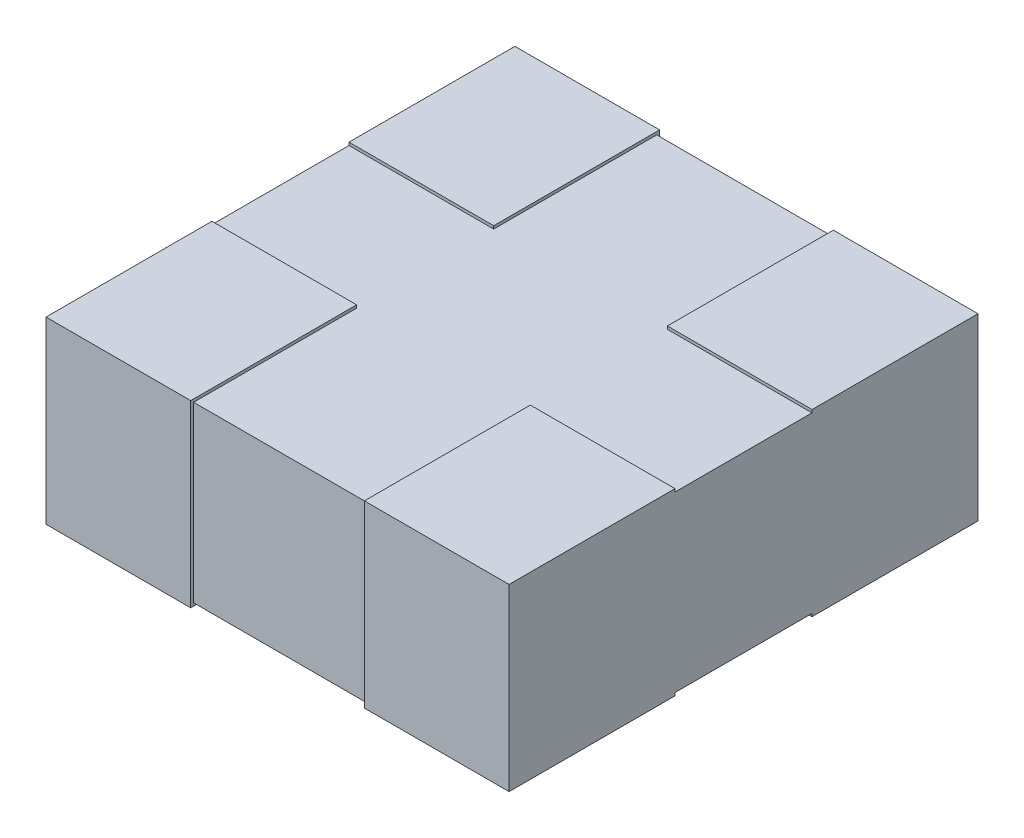
ISO-10303-21;
HEADER;
FILE_DESCRIPTION(('STEP AP214'),'2;1');
FILE_NAME('part.step','',(''),(''),'','','');
FILE_SCHEMA(('AUTOMOTIVE_DESIGN { 1 0 10303 214 1 1 1 1 }'));
ENDSEC;
DATA;
#1=APPLICATION_CONTEXT('core data for automotive mechanical design processes');
#2=APPLICATION_PROTOCOL_DEFINITION('international standard','automotive_design',2000,#1);
#3=PRODUCT_CONTEXT('',#1,'mechanical');
#4=PRODUCT('Part','Part','',(#3));
#5=PRODUCT_RELATED_PRODUCT_CATEGORY('part','',(#4));
#6=PRODUCT_DEFINITION_FORMATION('','',#4);
#7=PRODUCT_DEFINITION_CONTEXT('part definition',#1,'design');
#8=PRODUCT_DEFINITION('design','',#6,#7);
#9=PRODUCT_DEFINITION_SHAPE('','',#8);
#10=(LENGTH_UNIT() NAMED_UNIT(*) SI_UNIT(.MILLI.,.METRE.));
#11=(NAMED_UNIT(*) PLANE_ANGLE_UNIT() SI_UNIT($,.RADIAN.));
#12=(NAMED_UNIT(*) SI_UNIT($,.STERADIAN.) SOLID_ANGLE_UNIT());
#13=UNCERTAINTY_MEASURE_WITH_UNIT(LENGTH_MEASURE(1.E-05),#10,'distance_accuracy_value','');
#14=(GEOMETRIC_REPRESENTATION_CONTEXT(3) GLOBAL_UNCERTAINTY_ASSIGNED_CONTEXT((#13)) GLOBAL_UNIT_ASSIGNED_CONTEXT((#10,
#11,#12)) REPRESENTATION_CONTEXT('',''));
#15=CARTESIAN_POINT('',(0.,0.,0.));
#16=DIRECTION('',(0.,0.,1.));
#17=DIRECTION('',(1.,0.,0.));
#18=AXIS2_PLACEMENT_3D('',#15,#16,#17);
#19=CARTESIAN_POINT('',(0.,0.6,0.));
#20=DIRECTION('',(0.,1.,0.));
#21=DIRECTION('',(0.,0.,1.));
#22=AXIS2_PLACEMENT_3D('',#19,#20,#21);
#23=PLANE('',#22);
#24=DIRECTION('',(0.,0.,-1.));
#25=VECTOR('',#24,1.);
#26=CARTESIAN_POINT('',(0.8,0.6,-0.8));
#27=LINE('',#26,#25);
#28=CARTESIAN_POINT('',(0.8,0.6,0.236736987308278));
#29=VERTEX_POINT('',#28);
#30=CARTESIAN_POINT('',(0.8,0.6,-0.236736987308278));
#31=VERTEX_POINT('',#30);
#32=EDGE_CURVE('E406',#29,#31,#27,.T.);
#33=ORIENTED_EDGE('',*,*,#32,.T.);
#34=DIRECTION('',(-1.,0.,0.));
#35=VECTOR('',#34,1.);
#36=CARTESIAN_POINT('',(0.,0.6,-0.236736987308278));
#37=LINE('',#36,#35);
#38=CARTESIAN_POINT('',(0.3,0.6,-0.236736987308278));
#39=VERTEX_POINT('',#38);
#40=EDGE_CURVE('E50',#31,#39,#37,.T.);
#41=ORIENTED_EDGE('',*,*,#40,.T.);
#42=DIRECTION('',(0.,0.,-1.));
#43=VECTOR('',#42,1.);
#44=CARTESIAN_POINT('',(0.3,0.6,0.));
#45=LINE('',#44,#43);
#46=CARTESIAN_POINT('',(0.3,0.6,-0.8));
#47=VERTEX_POINT('',#46);
#48=EDGE_CURVE('E271',#39,#47,#45,.T.);
#49=ORIENTED_EDGE('',*,*,#48,.T.);
#50=DIRECTION('',(-1.,0.,0.));
#51=VECTOR('',#50,1.);
#52=CARTESIAN_POINT('',(-0.8,0.6,-0.8));
#53=LINE('',#52,#51);
#54=CARTESIAN_POINT('',(-0.3,0.6,-0.8));
#55=VERTEX_POINT('',#54);
#56=EDGE_CURVE('E408',#47,#55,#53,.T.);
#57=ORIENTED_EDGE('',*,*,#56,.T.);
#58=DIRECTION('',(0.,0.,1.));
#59=VECTOR('',#58,1.);
#60=CARTESIAN_POINT('',(-0.3,0.6,0.));
#61=LINE('',#60,#59);
#62=CARTESIAN_POINT('',(-0.3,0.6,-0.236736987308278));
#63=VERTEX_POINT('',#62);
#64=EDGE_CURVE('E351',#55,#63,#61,.T.);
#65=ORIENTED_EDGE('',*,*,#64,.T.);
#66=DIRECTION('',(1.,0.,0.));
#67=VECTOR('',#66,1.);
#68=CARTESIAN_POINT('',(0.,0.6,-0.236736987308278));
#69=LINE('',#68,#67);
#70=CARTESIAN_POINT('',(-0.8,0.6,-0.236736987308278));
#71=VERTEX_POINT('',#70);
#72=EDGE_CURVE('E354',#71,#63,#69,.T.);
#73=ORIENTED_EDGE('',*,*,#72,.F.);
#74=DIRECTION('',(0.,0.,1.));
#75=VECTOR('',#74,1.);
#76=CARTESIAN_POINT('',(-0.8,0.6,-0.8));
#77=LINE('',#76,#75);
#78=CARTESIAN_POINT('',(-0.8,0.6,0.236736987308278));
#79=VERTEX_POINT('',#78);
#80=EDGE_CURVE('E400',#71,#79,#77,.T.);
#81=ORIENTED_EDGE('',*,*,#80,.T.);
#82=DIRECTION('',(-1.,0.,0.));
#83=VECTOR('',#82,1.);
#84=CARTESIAN_POINT('',(0.,0.6,0.236736987308278));
#85=LINE('',#84,#83);
#86=CARTESIAN_POINT('',(-0.3,0.6,0.236736987308278));
#87=VERTEX_POINT('',#86);
#88=EDGE_CURVE('E396',#87,#79,#85,.T.);
#89=ORIENTED_EDGE('',*,*,#88,.F.);
#90=DIRECTION('',(0.,0.,-1.));
#91=VECTOR('',#90,1.);
#92=CARTESIAN_POINT('',(-0.3,0.6,0.));
#93=LINE('',#92,#91);
#94=CARTESIAN_POINT('',(-0.3,0.6,0.8));
#95=VERTEX_POINT('',#94);
#96=EDGE_CURVE('E394',#95,#87,#93,.T.);
#97=ORIENTED_EDGE('',*,*,#96,.F.);
#98=DIRECTION('',(1.,0.,0.));
#99=VECTOR('',#98,1.);
#100=CARTESIAN_POINT('',(-0.8,0.6,0.8));
#101=LINE('',#100,#99);
#102=CARTESIAN_POINT('',(0.3,0.6,0.8));
#103=VERTEX_POINT('',#102);
#104=EDGE_CURVE('E402',#95,#103,#101,.T.);
#105=ORIENTED_EDGE('',*,*,#104,.T.);
#106=DIRECTION('',(0.,0.,1.));
#107=VECTOR('',#106,1.);
#108=CARTESIAN_POINT('',(0.3,0.6,0.));
#109=LINE('',#108,#107);
#110=CARTESIAN_POINT('',(0.3,0.6,0.236736987308278));
#111=VERTEX_POINT('',#110);
#112=EDGE_CURVE('E309',#111,#103,#109,.T.);
#113=ORIENTED_EDGE('',*,*,#112,.F.);
#114=DIRECTION('',(1.,0.,0.));
#115=VECTOR('',#114,1.);
#116=CARTESIAN_POINT('',(0.,0.6,0.236736987308278));
#117=LINE('',#116,#115);
#118=EDGE_CURVE('E311',#111,#29,#117,.T.);
#119=ORIENTED_EDGE('',*,*,#118,.T.);
#120=EDGE_LOOP('',(#33,#41,#49,#57,#65,#73,#81,#89,#97,#105,#113,#119));
#121=FACE_BOUND('',#120,.T.);
#122=ADVANCED_FACE('F35',(#121),#23,.T.);
#123=CARTESIAN_POINT('',(0.,0.,0.));
#124=DIRECTION('',(0.,1.,0.));
#125=DIRECTION('',(0.,0.,1.));
#126=AXIS2_PLACEMENT_3D('',#123,#124,#125);
#127=PLANE('',#126);
#128=DIRECTION('',(-1.,0.,0.));
#129=VECTOR('',#128,1.);
#130=CARTESIAN_POINT('',(0.,0.,-0.236736987308278));
#131=LINE('',#130,#129);
#132=CARTESIAN_POINT('',(0.8,0.,-0.236736987308278));
#133=VERTEX_POINT('',#132);
#134=CARTESIAN_POINT('',(0.3,0.,-0.236736987308278));
#135=VERTEX_POINT('',#134);
#136=EDGE_CURVE('E263',#133,#135,#131,.T.);
#137=ORIENTED_EDGE('',*,*,#136,.F.);
#138=DIRECTION('',(0.,0.,-1.));
#139=VECTOR('',#138,1.);
#140=CARTESIAN_POINT('',(0.8,0.,-0.8));
#141=LINE('',#140,#139);
#142=CARTESIAN_POINT('',(0.8,0.,0.236736987308277));
#143=VERTEX_POINT('',#142);
#144=EDGE_CURVE('E415',#143,#133,#141,.T.);
#145=ORIENTED_EDGE('',*,*,#144,.F.);
#146=DIRECTION('',(1.,0.,0.));
#147=VECTOR('',#146,1.);
#148=CARTESIAN_POINT('',(0.,0.,0.236736987308278));
#149=LINE('',#148,#147);
#150=CARTESIAN_POINT('',(0.3,0.,0.236736987308278));
#151=VERTEX_POINT('',#150);
#152=EDGE_CURVE('E43',#151,#143,#149,.T.);
#153=ORIENTED_EDGE('',*,*,#152,.F.);
#154=DIRECTION('',(0.,0.,1.));
#155=VECTOR('',#154,1.);
#156=CARTESIAN_POINT('',(0.3,0.,0.));
#157=LINE('',#156,#155);
#158=CARTESIAN_POINT('',(0.3,0.,0.8));
#159=VERTEX_POINT('',#158);
#160=EDGE_CURVE('E429',#151,#159,#157,.T.);
#161=ORIENTED_EDGE('',*,*,#160,.T.);
#162=DIRECTION('',(1.,0.,0.));
#163=VECTOR('',#162,1.);
#164=CARTESIAN_POINT('',(-0.8,0.,0.8));
#165=LINE('',#164,#163);
#166=CARTESIAN_POINT('',(-0.3,0.,0.8));
#167=VERTEX_POINT('',#166);
#168=EDGE_CURVE('E412',#167,#159,#165,.T.);
#169=ORIENTED_EDGE('',*,*,#168,.F.);
#170=DIRECTION('',(0.,0.,-1.));
#171=VECTOR('',#170,1.);
#172=CARTESIAN_POINT('',(-0.3,0.,0.));
#173=LINE('',#172,#171);
#174=CARTESIAN_POINT('',(-0.3,0.,0.236736987308278));
#175=VERTEX_POINT('',#174);
#176=EDGE_CURVE('E410',#167,#175,#173,.T.);
#177=ORIENTED_EDGE('',*,*,#176,.T.);
#178=DIRECTION('',(-1.,0.,0.));
#179=VECTOR('',#178,1.);
#180=CARTESIAN_POINT('',(0.,0.,0.236736987308278));
#181=LINE('',#180,#179);
#182=CARTESIAN_POINT('',(-0.8,0.,0.236736987308278));
#183=VERTEX_POINT('',#182);
#184=EDGE_CURVE('E421',#175,#183,#181,.T.);
#185=ORIENTED_EDGE('',*,*,#184,.T.);
#186=DIRECTION('',(0.,0.,1.));
#187=VECTOR('',#186,1.);
#188=CARTESIAN_POINT('',(-0.8,0.,-0.8));
#189=LINE('',#188,#187);
#190=CARTESIAN_POINT('',(-0.8,0.,-0.236736987308278));
#191=VERTEX_POINT('',#190);
#192=EDGE_CURVE('E399',#191,#183,#189,.T.);
#193=ORIENTED_EDGE('',*,*,#192,.F.);
#194=DIRECTION('',(1.,0.,0.));
#195=VECTOR('',#194,1.);
#196=CARTESIAN_POINT('',(0.,0.,-0.236736987308278));
#197=LINE('',#196,#195);
#198=CARTESIAN_POINT('',(-0.3,0.,-0.236736987308278));
#199=VERTEX_POINT('',#198);
#200=EDGE_CURVE('E426',#191,#199,#197,.T.);
#201=ORIENTED_EDGE('',*,*,#200,.T.);
#202=DIRECTION('',(0.,0.,1.));
#203=VECTOR('',#202,1.);
#204=CARTESIAN_POINT('',(-0.3,0.,0.));
#205=LINE('',#204,#203);
#206=CARTESIAN_POINT('',(-0.3,0.,-0.8));
#207=VERTEX_POINT('',#206);
#208=EDGE_CURVE('E424',#207,#199,#205,.T.);
#209=ORIENTED_EDGE('',*,*,#208,.F.);
#210=DIRECTION('',(-1.,0.,0.));
#211=VECTOR('',#210,1.);
#212=CARTESIAN_POINT('',(-0.8,0.,-0.8));
#213=LINE('',#212,#211);
#214=CARTESIAN_POINT('',(0.3,0.,-0.8));
#215=VERTEX_POINT('',#214);
#216=EDGE_CURVE('E403',#215,#207,#213,.T.);
#217=ORIENTED_EDGE('',*,*,#216,.F.);
#218=DIRECTION('',(0.,0.,-1.));
#219=VECTOR('',#218,1.);
#220=CARTESIAN_POINT('',(0.3,0.,0.));
#221=LINE('',#220,#219);
#222=EDGE_CURVE('E58',#135,#215,#221,.T.);
#223=ORIENTED_EDGE('',*,*,#222,.F.);
#224=EDGE_LOOP('',(#137,#145,#153,#161,#169,#177,#185,#193,#201,#209,#217,#223));
#225=FACE_BOUND('',#224,.T.);
#226=ADVANCED_FACE('F438',(#225),#127,.F.);
#227=CARTESIAN_POINT('',(-0.8,0.6,-0.8));
#228=DIRECTION('',(0.,0.,1.));
#229=DIRECTION('',(1.,0.,0.));
#230=AXIS2_PLACEMENT_3D('',#227,#228,#229);
#231=PLANE('',#230);
#232=DIRECTION('',(0.,1.,0.));
#233=VECTOR('',#232,1.);
#234=CARTESIAN_POINT('',(0.3,0.6,-0.8));
#235=LINE('',#234,#233);
#236=EDGE_CURVE('E11',#215,#47,#235,.T.);
#237=ORIENTED_EDGE('',*,*,#236,.F.);
#238=ORIENTED_EDGE('',*,*,#216,.T.);
#239=DIRECTION('',(0.,-1.,0.));
#240=VECTOR('',#239,1.);
#241=CARTESIAN_POINT('',(-0.3,0.6,-0.8));
#242=LINE('',#241,#240);
#243=EDGE_CURVE('E342',#55,#207,#242,.T.);
#244=ORIENTED_EDGE('',*,*,#243,.F.);
#245=ORIENTED_EDGE('',*,*,#56,.F.);
#246=EDGE_LOOP('',(#237,#238,#244,#245));
#247=FACE_BOUND('',#246,.T.);
#248=ADVANCED_FACE('F469',(#247),#231,.F.);
#249=CARTESIAN_POINT('',(-0.8,0.6,-0.8));
#250=DIRECTION('',(1.,0.,0.));
#251=DIRECTION('',(0.,0.,-1.));
#252=AXIS2_PLACEMENT_3D('',#249,#250,#251);
#253=PLANE('',#252);
#254=ORIENTED_EDGE('',*,*,#80,.F.);
#255=DIRECTION('',(0.,1.,0.));
#256=VECTOR('',#255,1.);
#257=CARTESIAN_POINT('',(-0.8,-0.01,-0.236736987308278));
#258=LINE('',#257,#256);
#259=CARTESIAN_POINT('',(-0.8,0.61,-0.236736987308278));
#260=VERTEX_POINT('',#259);
#261=EDGE_CURVE('E335',#71,#260,#258,.T.);
#262=ORIENTED_EDGE('',*,*,#261,.T.);
#263=DIRECTION('',(0.,0.,-1.));
#264=VECTOR('',#263,1.);
#265=CARTESIAN_POINT('',(-0.8,0.61,-0.236736987308278));
#266=LINE('',#265,#264);
#267=CARTESIAN_POINT('',(-0.8,0.61,-0.81));
#268=VERTEX_POINT('',#267);
#269=EDGE_CURVE('E319',#260,#268,#266,.T.);
#270=ORIENTED_EDGE('',*,*,#269,.T.);
#271=DIRECTION('',(0.,-1.,0.));
#272=VECTOR('',#271,1.);
#273=CARTESIAN_POINT('',(-0.8,0.61,-0.81));
#274=LINE('',#273,#272);
#275=CARTESIAN_POINT('',(-0.8,-0.01,-0.81));
#276=VERTEX_POINT('',#275);
#277=EDGE_CURVE('E314',#268,#276,#274,.T.);
#278=ORIENTED_EDGE('',*,*,#277,.T.);
#279=DIRECTION('',(0.,0.,1.));
#280=VECTOR('',#279,1.);
#281=CARTESIAN_POINT('',(-0.8,-0.01,-0.81));
#282=LINE('',#281,#280);
#283=CARTESIAN_POINT('',(-0.8,-0.01,-0.236736987308278));
#284=VERTEX_POINT('',#283);
#285=EDGE_CURVE('E332',#276,#284,#282,.T.);
#286=ORIENTED_EDGE('',*,*,#285,.T.);
#287=EDGE_CURVE('E336',#284,#191,#258,.T.);
#288=ORIENTED_EDGE('',*,*,#287,.T.);
#289=ORIENTED_EDGE('',*,*,#192,.T.);
#290=DIRECTION('',(0.,-1.,0.));
#291=VECTOR('',#290,1.);
#292=CARTESIAN_POINT('',(-0.8,-0.01,0.236736987308278));
#293=LINE('',#292,#291);
#294=CARTESIAN_POINT('',(-0.8,-0.01,0.236736987308278));
#295=VERTEX_POINT('',#294);
#296=EDGE_CURVE('E380',#183,#295,#293,.T.);
#297=ORIENTED_EDGE('',*,*,#296,.T.);
#298=DIRECTION('',(0.,0.,1.));
#299=VECTOR('',#298,1.);
#300=CARTESIAN_POINT('',(-0.8,-0.01,0.81));
#301=LINE('',#300,#299);
#302=CARTESIAN_POINT('',(-0.8,-0.01,0.81));
#303=VERTEX_POINT('',#302);
#304=EDGE_CURVE('E356',#295,#303,#301,.T.);
#305=ORIENTED_EDGE('',*,*,#304,.T.);
#306=DIRECTION('',(0.,1.,0.));
#307=VECTOR('',#306,1.);
#308=CARTESIAN_POINT('',(-0.8,0.61,0.81));
#309=LINE('',#308,#307);
#310=CARTESIAN_POINT('',(-0.8,0.61,0.81));
#311=VERTEX_POINT('',#310);
#312=EDGE_CURVE('E374',#303,#311,#309,.T.);
#313=ORIENTED_EDGE('',*,*,#312,.T.);
#314=DIRECTION('',(0.,0.,-1.));
#315=VECTOR('',#314,1.);
#316=CARTESIAN_POINT('',(-0.8,0.61,0.236736987308278));
#317=LINE('',#316,#315);
#318=CARTESIAN_POINT('',(-0.8,0.61,0.236736987308278));
#319=VERTEX_POINT('',#318);
#320=EDGE_CURVE('E377',#311,#319,#317,.T.);
#321=ORIENTED_EDGE('',*,*,#320,.T.);
#322=EDGE_CURVE('E361',#319,#79,#293,.T.);
#323=ORIENTED_EDGE('',*,*,#322,.T.);
#324=EDGE_LOOP('',(#254,#262,#270,#278,#286,#288,#289,#297,#305,#313,#321,#323));
#325=FACE_BOUND('',#324,.T.);
#326=ADVANCED_FACE('F37',(#325),#253,.F.);
#327=CARTESIAN_POINT('',(-0.8,0.6,0.8));
#328=DIRECTION('',(0.,0.,-1.));
#329=DIRECTION('',(-1.,0.,0.));
#330=AXIS2_PLACEMENT_3D('',#327,#328,#329);
#331=PLANE('',#330);
#332=ORIENTED_EDGE('',*,*,#168,.T.);
#333=DIRECTION('',(0.,1.,0.));
#334=VECTOR('',#333,1.);
#335=CARTESIAN_POINT('',(0.3,0.6,0.8));
#336=LINE('',#335,#334);
#337=EDGE_CURVE('E298',#159,#103,#336,.T.);
#338=ORIENTED_EDGE('',*,*,#337,.T.);
#339=ORIENTED_EDGE('',*,*,#104,.F.);
#340=DIRECTION('',(0.,-1.,0.));
#341=VECTOR('',#340,1.);
#342=CARTESIAN_POINT('',(-0.3,0.6,0.8));
#343=LINE('',#342,#341);
#344=EDGE_CURVE('E386',#95,#167,#343,.T.);
#345=ORIENTED_EDGE('',*,*,#344,.T.);
#346=EDGE_LOOP('',(#332,#338,#339,#345));
#347=FACE_BOUND('',#346,.T.);
#348=ADVANCED_FACE('F480',(#347),#331,.F.);
#349=CARTESIAN_POINT('',(0.8,0.6,-0.8));
#350=DIRECTION('',(-1.,0.,0.));
#351=DIRECTION('',(0.,0.,1.));
#352=AXIS2_PLACEMENT_3D('',#349,#350,#351);
#353=PLANE('',#352);
#354=DIRECTION('',(0.,1.,0.));
#355=VECTOR('',#354,1.);
#356=CARTESIAN_POINT('',(0.8,-0.01,-0.236736987308278));
#357=LINE('',#356,#355);
#358=CARTESIAN_POINT('',(0.8,0.61,-0.236736987308278));
#359=VERTEX_POINT('',#358);
#360=EDGE_CURVE('E259',#31,#359,#357,.T.);
#361=ORIENTED_EDGE('',*,*,#360,.F.);
#362=ORIENTED_EDGE('',*,*,#32,.F.);
#363=DIRECTION('',(0.,-1.,0.));
#364=VECTOR('',#363,1.);
#365=CARTESIAN_POINT('',(0.8,-0.01,0.236736987308278));
#366=LINE('',#365,#364);
#367=CARTESIAN_POINT('',(0.8,0.61,0.236736987308278));
#368=VERTEX_POINT('',#367);
#369=EDGE_CURVE('E290',#368,#29,#366,.T.);
#370=ORIENTED_EDGE('',*,*,#369,.F.);
#371=DIRECTION('',(0.,0.,-1.));
#372=VECTOR('',#371,1.);
#373=CARTESIAN_POINT('',(0.8,0.61,0.236736987308278));
#374=LINE('',#373,#372);
#375=CARTESIAN_POINT('',(0.8,0.61,0.81));
#376=VERTEX_POINT('',#375);
#377=EDGE_CURVE('E292',#376,#368,#374,.T.);
#378=ORIENTED_EDGE('',*,*,#377,.F.);
#379=DIRECTION('',(0.,1.,0.));
#380=VECTOR('',#379,1.);
#381=CARTESIAN_POINT('',(0.8,0.61,0.81));
#382=LINE('',#381,#380);
#383=CARTESIAN_POINT('',(0.8,-0.01,0.81));
#384=VERTEX_POINT('',#383);
#385=EDGE_CURVE('E278',#384,#376,#382,.T.);
#386=ORIENTED_EDGE('',*,*,#385,.F.);
#387=DIRECTION('',(0.,0.,1.));
#388=VECTOR('',#387,1.);
#389=CARTESIAN_POINT('',(0.8,-0.01,0.81));
#390=LINE('',#389,#388);
#391=CARTESIAN_POINT('',(0.8,-0.01,0.236736987308278));
#392=VERTEX_POINT('',#391);
#393=EDGE_CURVE('E273',#392,#384,#390,.T.);
#394=ORIENTED_EDGE('',*,*,#393,.F.);
#395=EDGE_CURVE('E289',#143,#392,#366,.T.);
#396=ORIENTED_EDGE('',*,*,#395,.F.);
#397=ORIENTED_EDGE('',*,*,#144,.T.);
#398=CARTESIAN_POINT('',(0.8,-0.01,-0.236736987308278));
#399=VERTEX_POINT('',#398);
#400=EDGE_CURVE('E249',#399,#133,#357,.T.);
#401=ORIENTED_EDGE('',*,*,#400,.F.);
#402=DIRECTION('',(0.,0.,1.));
#403=VECTOR('',#402,1.);
#404=CARTESIAN_POINT('',(0.8,-0.01,-0.81));
#405=LINE('',#404,#403);
#406=CARTESIAN_POINT('',(0.8,-0.01,-0.81));
#407=VERTEX_POINT('',#406);
#408=EDGE_CURVE('E247',#407,#399,#405,.T.);
#409=ORIENTED_EDGE('',*,*,#408,.F.);
#410=DIRECTION('',(0.,-1.,0.));
#411=VECTOR('',#410,1.);
#412=CARTESIAN_POINT('',(0.8,0.61,-0.81));
#413=LINE('',#412,#411);
#414=CARTESIAN_POINT('',(0.8,0.61,-0.81));
#415=VERTEX_POINT('',#414);
#416=EDGE_CURVE('E256',#415,#407,#413,.T.);
#417=ORIENTED_EDGE('',*,*,#416,.F.);
#418=DIRECTION('',(0.,0.,-1.));
#419=VECTOR('',#418,1.);
#420=CARTESIAN_POINT('',(0.8,0.61,-0.236736987308278));
#421=LINE('',#420,#419);
#422=EDGE_CURVE('E237',#359,#415,#421,.T.);
#423=ORIENTED_EDGE('',*,*,#422,.F.);
#424=EDGE_LOOP('',(#361,#362,#370,#378,#386,#394,#396,#397,#401,#409,#417,#423));
#425=FACE_BOUND('',#424,.T.);
#426=ADVANCED_FACE('F442',(#425),#353,.F.);
#427=CARTESIAN_POINT('',(-0.3,-0.01,0.236736987308278));
#428=DIRECTION('',(0.,0.,-1.));
#429=DIRECTION('',(-1.,0.,0.));
#430=AXIS2_PLACEMENT_3D('',#427,#428,#429);
#431=PLANE('',#430);
#432=ORIENTED_EDGE('',*,*,#184,.F.);
#433=DIRECTION('',(0.,-1.,0.));
#434=VECTOR('',#433,1.);
#435=CARTESIAN_POINT('',(-0.3,-0.01,0.236736987308278));
#436=LINE('',#435,#434);
#437=CARTESIAN_POINT('',(-0.3,-0.01,0.236736987308278));
#438=VERTEX_POINT('',#437);
#439=EDGE_CURVE('E367',#175,#438,#436,.T.);
#440=ORIENTED_EDGE('',*,*,#439,.T.);
#441=DIRECTION('',(-1.,0.,0.));
#442=VECTOR('',#441,1.);
#443=CARTESIAN_POINT('',(-0.3,-0.01,0.236736987308278));
#444=LINE('',#443,#442);
#445=EDGE_CURVE('E383',#438,#295,#444,.T.);
#446=ORIENTED_EDGE('',*,*,#445,.T.);
#447=ORIENTED_EDGE('',*,*,#296,.F.);
#448=EDGE_LOOP('',(#432,#440,#446,#447));
#449=FACE_BOUND('',#448,.T.);
#450=ADVANCED_FACE('F479',(#449),#431,.T.);
#451=CARTESIAN_POINT('',(-0.3,-0.01,0.81));
#452=DIRECTION('',(0.,-1.,0.));
#453=DIRECTION('',(0.,0.,-1.));
#454=AXIS2_PLACEMENT_3D('',#451,#452,#453);
#455=PLANE('',#454);
#456=ORIENTED_EDGE('',*,*,#304,.F.);
#457=ORIENTED_EDGE('',*,*,#445,.F.);
#458=DIRECTION('',(0.,0.,1.));
#459=VECTOR('',#458,1.);
#460=CARTESIAN_POINT('',(-0.3,-0.01,0.81));
#461=LINE('',#460,#459);
#462=CARTESIAN_POINT('',(-0.3,-0.01,0.81));
#463=VERTEX_POINT('',#462);
#464=EDGE_CURVE('E357',#438,#463,#461,.T.);
#465=ORIENTED_EDGE('',*,*,#464,.T.);
#466=DIRECTION('',(-1.,0.,0.));
#467=VECTOR('',#466,1.);
#468=CARTESIAN_POINT('',(-0.3,-0.01,0.81));
#469=LINE('',#468,#467);
#470=EDGE_CURVE('E371',#463,#303,#469,.T.);
#471=ORIENTED_EDGE('',*,*,#470,.T.);
#472=EDGE_LOOP('',(#456,#457,#465,#471));
#473=FACE_BOUND('',#472,.T.);
#474=ADVANCED_FACE('F472',(#473),#455,.T.);
#475=CARTESIAN_POINT('',(-0.3,0.61,0.236736987308278));
#476=VERTEX_POINT('',#475);
#477=EDGE_CURVE('E368',#476,#87,#436,.T.);
#478=ORIENTED_EDGE('',*,*,#477,.T.);
#479=ORIENTED_EDGE('',*,*,#88,.T.);
#480=ORIENTED_EDGE('',*,*,#322,.F.);
#481=DIRECTION('',(-1.,0.,0.));
#482=VECTOR('',#481,1.);
#483=CARTESIAN_POINT('',(-0.3,0.61,0.236736987308278));
#484=LINE('',#483,#482);
#485=EDGE_CURVE('E387',#476,#319,#484,.T.);
#486=ORIENTED_EDGE('',*,*,#485,.F.);
#487=EDGE_LOOP('',(#478,#479,#480,#486));
#488=FACE_BOUND('',#487,.T.);
#489=ADVANCED_FACE('F499',(#488),#431,.T.);
#490=CARTESIAN_POINT('',(-0.3,0.61,0.236736987308278));
#491=DIRECTION('',(0.,1.,0.));
#492=DIRECTION('',(0.,0.,1.));
#493=AXIS2_PLACEMENT_3D('',#490,#491,#492);
#494=PLANE('',#493);
#495=ORIENTED_EDGE('',*,*,#320,.F.);
#496=DIRECTION('',(-1.,0.,0.));
#497=VECTOR('',#496,1.);
#498=CARTESIAN_POINT('',(-0.3,0.61,0.81));
#499=LINE('',#498,#497);
#500=CARTESIAN_POINT('',(-0.3,0.61,0.81));
#501=VERTEX_POINT('',#500);
#502=EDGE_CURVE('E389',#501,#311,#499,.T.);
#503=ORIENTED_EDGE('',*,*,#502,.F.);
#504=DIRECTION('',(0.,0.,-1.));
#505=VECTOR('',#504,1.);
#506=CARTESIAN_POINT('',(-0.3,0.61,0.236736987308278));
#507=LINE('',#506,#505);
#508=EDGE_CURVE('E364',#501,#476,#507,.T.);
#509=ORIENTED_EDGE('',*,*,#508,.T.);
#510=ORIENTED_EDGE('',*,*,#485,.T.);
#511=EDGE_LOOP('',(#495,#503,#509,#510));
#512=FACE_BOUND('',#511,.T.);
#513=ADVANCED_FACE('F503',(#512),#494,.T.);
#514=CARTESIAN_POINT('',(-0.3,0.61,0.81));
#515=DIRECTION('',(0.,0.,1.));
#516=DIRECTION('',(1.,0.,0.));
#517=AXIS2_PLACEMENT_3D('',#514,#515,#516);
#518=PLANE('',#517);
#519=ORIENTED_EDGE('',*,*,#312,.F.);
#520=ORIENTED_EDGE('',*,*,#470,.F.);
#521=DIRECTION('',(0.,1.,0.));
#522=VECTOR('',#521,1.);
#523=CARTESIAN_POINT('',(-0.3,0.61,0.81));
#524=LINE('',#523,#522);
#525=EDGE_CURVE('E360',#463,#501,#524,.T.);
#526=ORIENTED_EDGE('',*,*,#525,.T.);
#527=ORIENTED_EDGE('',*,*,#502,.T.);
#528=EDGE_LOOP('',(#519,#520,#526,#527));
#529=FACE_BOUND('',#528,.T.);
#530=ADVANCED_FACE('F508',(#529),#518,.T.);
#531=CARTESIAN_POINT('',(-0.3,0.,0.));
#532=DIRECTION('',(1.,0.,0.));
#533=DIRECTION('',(0.,0.,-1.));
#534=AXIS2_PLACEMENT_3D('',#531,#532,#533);
#535=PLANE('',#534);
#536=ORIENTED_EDGE('',*,*,#344,.F.);
#537=ORIENTED_EDGE('',*,*,#96,.T.);
#538=ORIENTED_EDGE('',*,*,#477,.F.);
#539=ORIENTED_EDGE('',*,*,#508,.F.);
#540=ORIENTED_EDGE('',*,*,#525,.F.);
#541=ORIENTED_EDGE('',*,*,#464,.F.);
#542=ORIENTED_EDGE('',*,*,#439,.F.);
#543=ORIENTED_EDGE('',*,*,#176,.F.);
#544=EDGE_LOOP('',(#536,#537,#538,#539,#540,#541,#542,#543));
#545=FACE_BOUND('',#544,.T.);
#546=ADVANCED_FACE('F496',(#545),#535,.T.);
#547=CARTESIAN_POINT('',(-0.3,-0.01,-0.236736987308278));
#548=DIRECTION('',(0.,0.,1.));
#549=DIRECTION('',(1.,0.,0.));
#550=AXIS2_PLACEMENT_3D('',#547,#548,#549);
#551=PLANE('',#550);
#552=ORIENTED_EDGE('',*,*,#200,.F.);
#553=ORIENTED_EDGE('',*,*,#287,.F.);
#554=DIRECTION('',(-1.,0.,0.));
#555=VECTOR('',#554,1.);
#556=CARTESIAN_POINT('',(-0.3,-0.01,-0.236736987308278));
#557=LINE('',#556,#555);
#558=CARTESIAN_POINT('',(-0.3,-0.01,-0.236736987308278));
#559=VERTEX_POINT('',#558);
#560=EDGE_CURVE('E346',#559,#284,#557,.T.);
#561=ORIENTED_EDGE('',*,*,#560,.F.);
#562=DIRECTION('',(0.,1.,0.));
#563=VECTOR('',#562,1.);
#564=CARTESIAN_POINT('',(-0.3,-0.01,-0.236736987308278));
#565=LINE('',#564,#563);
#566=EDGE_CURVE('E323',#559,#199,#565,.T.);
#567=ORIENTED_EDGE('',*,*,#566,.T.);
#568=EDGE_LOOP('',(#552,#553,#561,#567));
#569=FACE_BOUND('',#568,.T.);
#570=ADVANCED_FACE('F522',(#569),#551,.T.);
#571=CARTESIAN_POINT('',(-0.3,0.61,-0.81));
#572=DIRECTION('',(0.,0.,-1.));
#573=DIRECTION('',(-1.,0.,0.));
#574=AXIS2_PLACEMENT_3D('',#571,#572,#573);
#575=PLANE('',#574);
#576=ORIENTED_EDGE('',*,*,#277,.F.);
#577=DIRECTION('',(-1.,0.,0.));
#578=VECTOR('',#577,1.);
#579=CARTESIAN_POINT('',(-0.3,0.61,-0.81));
#580=LINE('',#579,#578);
#581=CARTESIAN_POINT('',(-0.3,0.61,-0.81));
#582=VERTEX_POINT('',#581);
#583=EDGE_CURVE('E340',#582,#268,#580,.T.);
#584=ORIENTED_EDGE('',*,*,#583,.F.);
#585=DIRECTION('',(0.,-1.,0.));
#586=VECTOR('',#585,1.);
#587=CARTESIAN_POINT('',(-0.3,0.61,-0.81));
#588=LINE('',#587,#586);
#589=CARTESIAN_POINT('',(-0.3,-0.01,-0.81));
#590=VERTEX_POINT('',#589);
#591=EDGE_CURVE('E315',#582,#590,#588,.T.);
#592=ORIENTED_EDGE('',*,*,#591,.T.);
#593=DIRECTION('',(-1.,0.,0.));
#594=VECTOR('',#593,1.);
#595=CARTESIAN_POINT('',(-0.3,-0.01,-0.81));
#596=LINE('',#595,#594);
#597=EDGE_CURVE('E329',#590,#276,#596,.T.);
#598=ORIENTED_EDGE('',*,*,#597,.T.);
#599=EDGE_LOOP('',(#576,#584,#592,#598));
#600=FACE_BOUND('',#599,.T.);
#601=ADVANCED_FACE('F533',(#600),#575,.T.);
#602=CARTESIAN_POINT('',(-0.3,0.61,-0.236736987308278));
#603=DIRECTION('',(0.,1.,0.));
#604=DIRECTION('',(0.,0.,1.));
#605=AXIS2_PLACEMENT_3D('',#602,#603,#604);
#606=PLANE('',#605);
#607=ORIENTED_EDGE('',*,*,#269,.F.);
#608=DIRECTION('',(-1.,0.,0.));
#609=VECTOR('',#608,1.);
#610=CARTESIAN_POINT('',(-0.3,0.61,-0.236736987308278));
#611=LINE('',#610,#609);
#612=CARTESIAN_POINT('',(-0.3,0.61,-0.236736987308278));
#613=VERTEX_POINT('',#612);
#614=EDGE_CURVE('E343',#613,#260,#611,.T.);
#615=ORIENTED_EDGE('',*,*,#614,.F.);
#616=DIRECTION('',(0.,0.,-1.));
#617=VECTOR('',#616,1.);
#618=CARTESIAN_POINT('',(-0.3,0.61,-0.236736987308278));
#619=LINE('',#618,#617);
#620=EDGE_CURVE('E326',#613,#582,#619,.T.);
#621=ORIENTED_EDGE('',*,*,#620,.T.);
#622=ORIENTED_EDGE('',*,*,#583,.T.);
#623=EDGE_LOOP('',(#607,#615,#621,#622));
#624=FACE_BOUND('',#623,.T.);
#625=ADVANCED_FACE('F539',(#624),#606,.T.);
#626=ORIENTED_EDGE('',*,*,#261,.F.);
#627=ORIENTED_EDGE('',*,*,#72,.T.);
#628=EDGE_CURVE('E322',#63,#613,#565,.T.);
#629=ORIENTED_EDGE('',*,*,#628,.T.);
#630=ORIENTED_EDGE('',*,*,#614,.T.);
#631=EDGE_LOOP('',(#626,#627,#629,#630));
#632=FACE_BOUND('',#631,.T.);
#633=ADVANCED_FACE('F541',(#632),#551,.T.);
#634=CARTESIAN_POINT('',(-0.3,-0.01,-0.81));
#635=DIRECTION('',(0.,-1.,0.));
#636=DIRECTION('',(0.,0.,-1.));
#637=AXIS2_PLACEMENT_3D('',#634,#635,#636);
#638=PLANE('',#637);
#639=ORIENTED_EDGE('',*,*,#285,.F.);
#640=ORIENTED_EDGE('',*,*,#597,.F.);
#641=DIRECTION('',(0.,0.,1.));
#642=VECTOR('',#641,1.);
#643=CARTESIAN_POINT('',(-0.3,-0.01,-0.81));
#644=LINE('',#643,#642);
#645=EDGE_CURVE('E318',#590,#559,#644,.T.);
#646=ORIENTED_EDGE('',*,*,#645,.T.);
#647=ORIENTED_EDGE('',*,*,#560,.T.);
#648=EDGE_LOOP('',(#639,#640,#646,#647));
#649=FACE_BOUND('',#648,.T.);
#650=ADVANCED_FACE('F530',(#649),#638,.T.);
#651=CARTESIAN_POINT('',(-0.3,0.,0.));
#652=DIRECTION('',(-1.,0.,0.));
#653=DIRECTION('',(0.,0.,1.));
#654=AXIS2_PLACEMENT_3D('',#651,#652,#653);
#655=PLANE('',#654);
#656=ORIENTED_EDGE('',*,*,#64,.F.);
#657=ORIENTED_EDGE('',*,*,#243,.T.);
#658=ORIENTED_EDGE('',*,*,#208,.T.);
#659=ORIENTED_EDGE('',*,*,#566,.F.);
#660=ORIENTED_EDGE('',*,*,#645,.F.);
#661=ORIENTED_EDGE('',*,*,#591,.F.);
#662=ORIENTED_EDGE('',*,*,#620,.F.);
#663=ORIENTED_EDGE('',*,*,#628,.F.);
#664=EDGE_LOOP('',(#656,#657,#658,#659,#660,#661,#662,#663));
#665=FACE_BOUND('',#664,.T.);
#666=ADVANCED_FACE('F527',(#665),#655,.F.);
#667=CARTESIAN_POINT('',(0.3,-0.01,0.236736987308278));
#668=DIRECTION('',(0.,0.,1.));
#669=DIRECTION('',(1.,0.,0.));
#670=AXIS2_PLACEMENT_3D('',#667,#668,#669);
#671=PLANE('',#670);
#672=DIRECTION('',(0.,-1.,0.));
#673=VECTOR('',#672,1.);
#674=CARTESIAN_POINT('',(0.3,-0.01,0.236736987308278));
#675=LINE('',#674,#673);
#676=CARTESIAN_POINT('',(0.3,-0.01,0.236736987308278));
#677=VERTEX_POINT('',#676);
#678=EDGE_CURVE('E277',#151,#677,#675,.T.);
#679=ORIENTED_EDGE('',*,*,#678,.F.);
#680=ORIENTED_EDGE('',*,*,#152,.T.);
#681=ORIENTED_EDGE('',*,*,#395,.T.);
#682=DIRECTION('',(1.,0.,0.));
#683=VECTOR('',#682,1.);
#684=CARTESIAN_POINT('',(0.3,-0.01,0.236736987308278));
#685=LINE('',#684,#683);
#686=EDGE_CURVE('E286',#677,#392,#685,.T.);
#687=ORIENTED_EDGE('',*,*,#686,.F.);
#688=EDGE_LOOP('',(#679,#680,#681,#687));
#689=FACE_BOUND('',#688,.T.);
#690=ADVANCED_FACE('F436',(#689),#671,.F.);
#691=CARTESIAN_POINT('',(0.3,-0.01,0.81));
#692=DIRECTION('',(0.,1.,0.));
#693=DIRECTION('',(0.,0.,1.));
#694=AXIS2_PLACEMENT_3D('',#691,#692,#693);
#695=PLANE('',#694);
#696=ORIENTED_EDGE('',*,*,#393,.T.);
#697=DIRECTION('',(1.,0.,0.));
#698=VECTOR('',#697,1.);
#699=CARTESIAN_POINT('',(0.3,-0.01,0.81));
#700=LINE('',#699,#698);
#701=CARTESIAN_POINT('',(0.3,-0.01,0.81));
#702=VERTEX_POINT('',#701);
#703=EDGE_CURVE('E295',#702,#384,#700,.T.);
#704=ORIENTED_EDGE('',*,*,#703,.F.);
#705=DIRECTION('',(0.,0.,1.));
#706=VECTOR('',#705,1.);
#707=CARTESIAN_POINT('',(0.3,-0.01,0.81));
#708=LINE('',#707,#706);
#709=EDGE_CURVE('E274',#677,#702,#708,.T.);
#710=ORIENTED_EDGE('',*,*,#709,.F.);
#711=ORIENTED_EDGE('',*,*,#686,.T.);
#712=EDGE_LOOP('',(#696,#704,#710,#711));
#713=FACE_BOUND('',#712,.T.);
#714=ADVANCED_FACE('F652',(#713),#695,.F.);
#715=CARTESIAN_POINT('',(0.3,0.61,0.81));
#716=DIRECTION('',(0.,0.,-1.));
#717=DIRECTION('',(-1.,0.,0.));
#718=AXIS2_PLACEMENT_3D('',#715,#716,#717);
#719=PLANE('',#718);
#720=ORIENTED_EDGE('',*,*,#385,.T.);
#721=DIRECTION('',(1.,0.,0.));
#722=VECTOR('',#721,1.);
#723=CARTESIAN_POINT('',(0.3,0.61,0.81));
#724=LINE('',#723,#722);
#725=CARTESIAN_POINT('',(0.3,0.61,0.81));
#726=VERTEX_POINT('',#725);
#727=EDGE_CURVE('E299',#726,#376,#724,.T.);
#728=ORIENTED_EDGE('',*,*,#727,.F.);
#729=DIRECTION('',(0.,1.,0.));
#730=VECTOR('',#729,1.);
#731=CARTESIAN_POINT('',(0.3,0.61,0.81));
#732=LINE('',#731,#730);
#733=EDGE_CURVE('E284',#702,#726,#732,.T.);
#734=ORIENTED_EDGE('',*,*,#733,.F.);
#735=ORIENTED_EDGE('',*,*,#703,.T.);
#736=EDGE_LOOP('',(#720,#728,#734,#735));
#737=FACE_BOUND('',#736,.T.);
#738=ADVANCED_FACE('F662',(#737),#719,.F.);
#739=CARTESIAN_POINT('',(0.3,0.61,0.236736987308278));
#740=DIRECTION('',(0.,-1.,0.));
#741=DIRECTION('',(0.,0.,-1.));
#742=AXIS2_PLACEMENT_3D('',#739,#740,#741);
#743=PLANE('',#742);
#744=ORIENTED_EDGE('',*,*,#377,.T.);
#745=DIRECTION('',(1.,0.,0.));
#746=VECTOR('',#745,1.);
#747=CARTESIAN_POINT('',(0.3,0.61,0.236736987308278));
#748=LINE('',#747,#746);
#749=CARTESIAN_POINT('',(0.3,0.61,0.236736987308278));
#750=VERTEX_POINT('',#749);
#751=EDGE_CURVE('E302',#750,#368,#748,.T.);
#752=ORIENTED_EDGE('',*,*,#751,.F.);
#753=DIRECTION('',(0.,0.,-1.));
#754=VECTOR('',#753,1.);
#755=CARTESIAN_POINT('',(0.3,0.61,0.236736987308278));
#756=LINE('',#755,#754);
#757=EDGE_CURVE('E282',#726,#750,#756,.T.);
#758=ORIENTED_EDGE('',*,*,#757,.F.);
#759=ORIENTED_EDGE('',*,*,#727,.T.);
#760=EDGE_LOOP('',(#744,#752,#758,#759));
#761=FACE_BOUND('',#760,.T.);
#762=ADVANCED_FACE('F672',(#761),#743,.F.);
#763=ORIENTED_EDGE('',*,*,#118,.F.);
#764=EDGE_CURVE('E279',#750,#111,#675,.T.);
#765=ORIENTED_EDGE('',*,*,#764,.F.);
#766=ORIENTED_EDGE('',*,*,#751,.T.);
#767=ORIENTED_EDGE('',*,*,#369,.T.);
#768=EDGE_LOOP('',(#763,#765,#766,#767));
#769=FACE_BOUND('',#768,.T.);
#770=ADVANCED_FACE('F654',(#769),#671,.F.);
#771=CARTESIAN_POINT('',(0.3,0.,0.));
#772=DIRECTION('',(-1.,0.,0.));
#773=DIRECTION('',(0.,0.,-1.));
#774=AXIS2_PLACEMENT_3D('',#771,#772,#773);
#775=PLANE('',#774);
#776=ORIENTED_EDGE('',*,*,#764,.T.);
#777=ORIENTED_EDGE('',*,*,#112,.T.);
#778=ORIENTED_EDGE('',*,*,#337,.F.);
#779=ORIENTED_EDGE('',*,*,#160,.F.);
#780=ORIENTED_EDGE('',*,*,#678,.T.);
#781=ORIENTED_EDGE('',*,*,#709,.T.);
#782=ORIENTED_EDGE('',*,*,#733,.T.);
#783=ORIENTED_EDGE('',*,*,#757,.T.);
#784=EDGE_LOOP('',(#776,#777,#778,#779,#780,#781,#782,#783));
#785=FACE_BOUND('',#784,.T.);
#786=ADVANCED_FACE('F463',(#785),#775,.T.);
#787=CARTESIAN_POINT('',(0.3,-0.01,-0.236736987308278));
#788=DIRECTION('',(0.,0.,-1.));
#789=DIRECTION('',(-1.,0.,0.));
#790=AXIS2_PLACEMENT_3D('',#787,#788,#789);
#791=PLANE('',#790);
#792=ORIENTED_EDGE('',*,*,#400,.T.);
#793=ORIENTED_EDGE('',*,*,#136,.T.);
#794=DIRECTION('',(0.,1.,0.));
#795=VECTOR('',#794,1.);
#796=CARTESIAN_POINT('',(0.3,-0.01,-0.236736987308278));
#797=LINE('',#796,#795);
#798=CARTESIAN_POINT('',(0.3,-0.01,-0.236736987308278));
#799=VERTEX_POINT('',#798);
#800=EDGE_CURVE('E252',#799,#135,#797,.T.);
#801=ORIENTED_EDGE('',*,*,#800,.F.);
#802=DIRECTION('',(1.,0.,0.));
#803=VECTOR('',#802,1.);
#804=CARTESIAN_POINT('',(0.3,-0.01,-0.236736987308278));
#805=LINE('',#804,#803);
#806=EDGE_CURVE('E264',#799,#399,#805,.T.);
#807=ORIENTED_EDGE('',*,*,#806,.T.);
#808=EDGE_LOOP('',(#792,#793,#801,#807));
#809=FACE_BOUND('',#808,.T.);
#810=ADVANCED_FACE('F445',(#809),#791,.F.);
#811=CARTESIAN_POINT('',(0.3,0.61,-0.81));
#812=DIRECTION('',(0.,0.,1.));
#813=DIRECTION('',(1.,0.,0.));
#814=AXIS2_PLACEMENT_3D('',#811,#812,#813);
#815=PLANE('',#814);
#816=ORIENTED_EDGE('',*,*,#416,.T.);
#817=DIRECTION('',(1.,0.,0.));
#818=VECTOR('',#817,1.);
#819=CARTESIAN_POINT('',(0.3,-0.01,-0.81));
#820=LINE('',#819,#818);
#821=CARTESIAN_POINT('',(0.3,-0.01,-0.81));
#822=VERTEX_POINT('',#821);
#823=EDGE_CURVE('E246',#822,#407,#820,.T.);
#824=ORIENTED_EDGE('',*,*,#823,.F.);
#825=DIRECTION('',(0.,-1.,0.));
#826=VECTOR('',#825,1.);
#827=CARTESIAN_POINT('',(0.3,0.61,-0.81));
#828=LINE('',#827,#826);
#829=CARTESIAN_POINT('',(0.3,0.61,-0.81));
#830=VERTEX_POINT('',#829);
#831=EDGE_CURVE('E225',#830,#822,#828,.T.);
#832=ORIENTED_EDGE('',*,*,#831,.F.);
#833=DIRECTION('',(1.,0.,0.));
#834=VECTOR('',#833,1.);
#835=CARTESIAN_POINT('',(0.3,0.61,-0.81));
#836=LINE('',#835,#834);
#837=EDGE_CURVE('E234',#830,#415,#836,.T.);
#838=ORIENTED_EDGE('',*,*,#837,.T.);
#839=EDGE_LOOP('',(#816,#824,#832,#838));
#840=FACE_BOUND('',#839,.T.);
#841=ADVANCED_FACE('F244',(#840),#815,.F.);
#842=CARTESIAN_POINT('',(0.3,-0.01,-0.81));
#843=DIRECTION('',(0.,1.,0.));
#844=DIRECTION('',(0.,0.,1.));
#845=AXIS2_PLACEMENT_3D('',#842,#843,#844);
#846=PLANE('',#845);
#847=ORIENTED_EDGE('',*,*,#408,.T.);
#848=ORIENTED_EDGE('',*,*,#806,.F.);
#849=DIRECTION('',(0.,0.,1.));
#850=VECTOR('',#849,1.);
#851=CARTESIAN_POINT('',(0.3,-0.01,-0.81));
#852=LINE('',#851,#850);
#853=EDGE_CURVE('E242',#822,#799,#852,.T.);
#854=ORIENTED_EDGE('',*,*,#853,.F.);
#855=ORIENTED_EDGE('',*,*,#823,.T.);
#856=EDGE_LOOP('',(#847,#848,#854,#855));
#857=FACE_BOUND('',#856,.T.);
#858=ADVANCED_FACE('F449',(#857),#846,.F.);
#859=ORIENTED_EDGE('',*,*,#40,.F.);
#860=ORIENTED_EDGE('',*,*,#360,.T.);
#861=DIRECTION('',(1.,0.,0.));
#862=VECTOR('',#861,1.);
#863=CARTESIAN_POINT('',(0.3,0.61,-0.236736987308278));
#864=LINE('',#863,#862);
#865=CARTESIAN_POINT('',(0.3,0.61,-0.236736987308278));
#866=VERTEX_POINT('',#865);
#867=EDGE_CURVE('E241',#866,#359,#864,.T.);
#868=ORIENTED_EDGE('',*,*,#867,.F.);
#869=EDGE_CURVE('E228',#39,#866,#797,.T.);
#870=ORIENTED_EDGE('',*,*,#869,.F.);
#871=EDGE_LOOP('',(#859,#860,#868,#870));
#872=FACE_BOUND('',#871,.T.);
#873=ADVANCED_FACE('F453',(#872),#791,.F.);
#874=CARTESIAN_POINT('',(0.3,0.61,-0.236736987308278));
#875=DIRECTION('',(0.,-1.,0.));
#876=DIRECTION('',(0.,0.,-1.));
#877=AXIS2_PLACEMENT_3D('',#874,#875,#876);
#878=PLANE('',#877);
#879=ORIENTED_EDGE('',*,*,#422,.T.);
#880=ORIENTED_EDGE('',*,*,#837,.F.);
#881=DIRECTION('',(0.,0.,-1.));
#882=VECTOR('',#881,1.);
#883=CARTESIAN_POINT('',(0.3,0.61,-0.236736987308278));
#884=LINE('',#883,#882);
#885=EDGE_CURVE('E221',#866,#830,#884,.T.);
#886=ORIENTED_EDGE('',*,*,#885,.F.);
#887=ORIENTED_EDGE('',*,*,#867,.T.);
#888=EDGE_LOOP('',(#879,#880,#886,#887));
#889=FACE_BOUND('',#888,.T.);
#890=ADVANCED_FACE('F235',(#889),#878,.F.);
#891=CARTESIAN_POINT('',(0.3,0.,0.));
#892=DIRECTION('',(1.,0.,0.));
#893=DIRECTION('',(0.,0.,1.));
#894=AXIS2_PLACEMENT_3D('',#891,#892,#893);
#895=PLANE('',#894);
#896=ORIENTED_EDGE('',*,*,#48,.F.);
#897=ORIENTED_EDGE('',*,*,#869,.T.);
#898=ORIENTED_EDGE('',*,*,#885,.T.);
#899=ORIENTED_EDGE('',*,*,#831,.T.);
#900=ORIENTED_EDGE('',*,*,#853,.T.);
#901=ORIENTED_EDGE('',*,*,#800,.T.);
#902=ORIENTED_EDGE('',*,*,#222,.T.);
#903=ORIENTED_EDGE('',*,*,#236,.T.);
#904=EDGE_LOOP('',(#896,#897,#898,#899,#900,#901,#902,#903));
#905=FACE_BOUND('',#904,.T.);
#906=ADVANCED_FACE('F223',(#905),#895,.F.);
#907=CLOSED_SHELL('',(#122,#226,#248,#326,#348,#426,#450,#474,#489,#513,#530,#546,#570,#601,
#625,#633,#650,#666,#690,#714,#738,#762,#770,#786,#810,#841,#858,#873,#890,#906));
#908=MANIFOLD_SOLID_BREP('B2',#907);
#909=ADVANCED_BREP_SHAPE_REPRESENTATION('',(#18,#908),#14);
#910=SHAPE_DEFINITION_REPRESENTATION(#9,#909);
ENDSEC;
END-ISO-10303-21;
